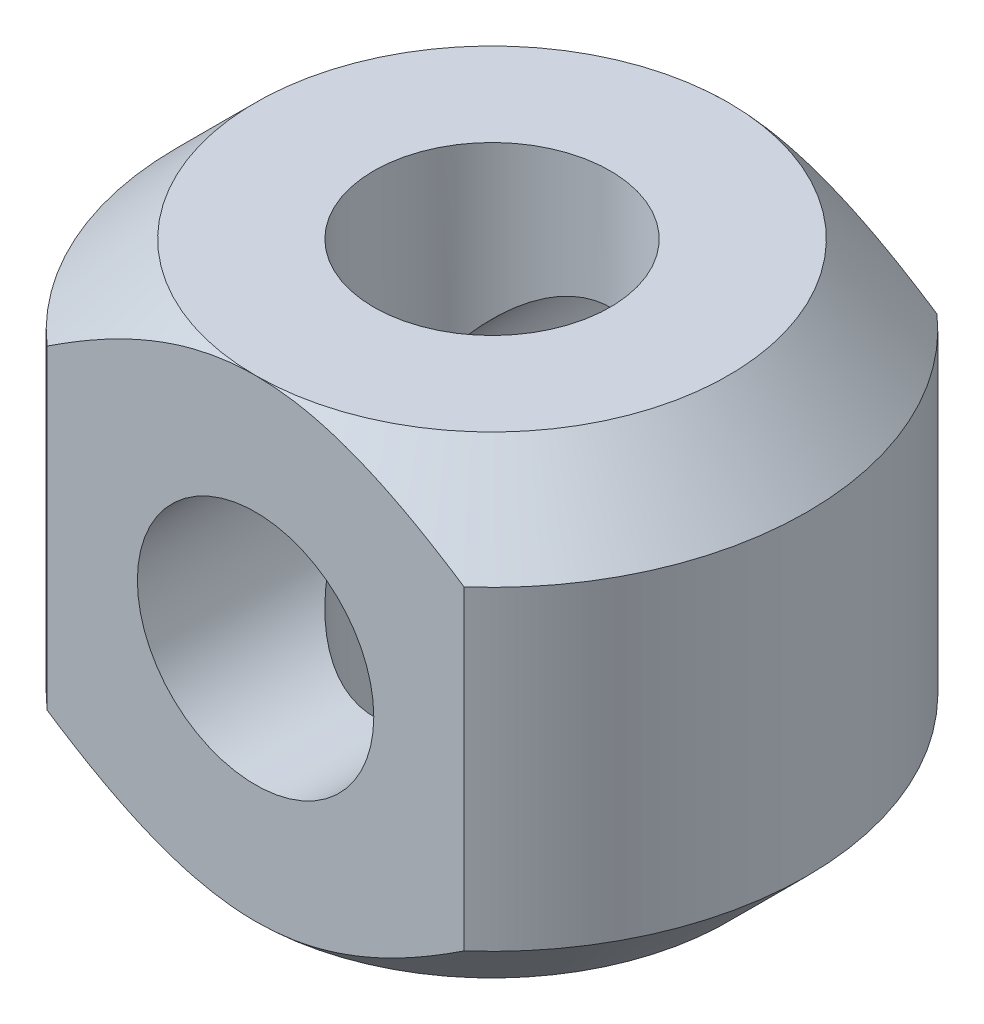
ISO-10303-21;
HEADER;
FILE_DESCRIPTION(('STEP AP214'),'2;1');
FILE_NAME('part.step','',(''),(''),'','','');
FILE_SCHEMA(('AUTOMOTIVE_DESIGN { 1 0 10303 214 1 1 1 1 }'));
ENDSEC;
DATA;
#1=APPLICATION_CONTEXT('core data for automotive mechanical design processes');
#2=APPLICATION_PROTOCOL_DEFINITION('international standard','automotive_design',2000,#1);
#3=PRODUCT_CONTEXT('',#1,'mechanical');
#4=PRODUCT('Part','Part','',(#3));
#5=PRODUCT_RELATED_PRODUCT_CATEGORY('part','',(#4));
#6=PRODUCT_DEFINITION_FORMATION('','',#4);
#7=PRODUCT_DEFINITION_CONTEXT('part definition',#1,'design');
#8=PRODUCT_DEFINITION('design','',#6,#7);
#9=PRODUCT_DEFINITION_SHAPE('','',#8);
#10=(LENGTH_UNIT() NAMED_UNIT(*) SI_UNIT(.MILLI.,.METRE.));
#11=(NAMED_UNIT(*) PLANE_ANGLE_UNIT() SI_UNIT($,.RADIAN.));
#12=(NAMED_UNIT(*) SI_UNIT($,.STERADIAN.) SOLID_ANGLE_UNIT());
#13=UNCERTAINTY_MEASURE_WITH_UNIT(LENGTH_MEASURE(1.E-05),#10,'distance_accuracy_value','');
#14=(GEOMETRIC_REPRESENTATION_CONTEXT(3) GLOBAL_UNCERTAINTY_ASSIGNED_CONTEXT((#13)) GLOBAL_UNIT_ASSIGNED_CONTEXT((#10,
#11,#12)) REPRESENTATION_CONTEXT('',''));
#15=CARTESIAN_POINT('',(0.,0.,0.));
#16=DIRECTION('',(0.,0.,1.));
#17=DIRECTION('',(1.,0.,0.));
#18=AXIS2_PLACEMENT_3D('',#15,#16,#17);
#19=CARTESIAN_POINT('',(0.,6.,0.));
#20=DIRECTION('',(0.,-1.,0.));
#21=DIRECTION('',(0.,0.,-1.));
#22=AXIS2_PLACEMENT_3D('',#19,#20,#21);
#23=CYLINDRICAL_SURFACE('',#22,1.5);
#24=CARTESIAN_POINT('',(0.,3.,0.));
#25=DIRECTION('',(0.,-0.707106781186547,0.707106781186547));
#26=DIRECTION('',(0.,-0.707106781186547,-0.707106781186547));
#27=AXIS2_PLACEMENT_3D('',#24,#25,#26);
#28=ELLIPSE('',#27,2.12132034355964,1.5);
#29=CARTESIAN_POINT('',(-1.5,3.,0.));
#30=VERTEX_POINT('',#29);
#31=CARTESIAN_POINT('',(1.5,3.,0.));
#32=VERTEX_POINT('',#31);
#33=EDGE_CURVE('E107',#30,#32,#28,.F.);
#34=ORIENTED_EDGE('',*,*,#33,.F.);
#35=CARTESIAN_POINT('',(0.,3.,0.));
#36=DIRECTION('',(0.,-0.707106781186547,-0.707106781186547));
#37=DIRECTION('',(0.,-0.707106781186547,0.707106781186547));
#38=AXIS2_PLACEMENT_3D('',#35,#36,#37);
#39=ELLIPSE('',#38,2.12132034355964,1.5);
#40=EDGE_CURVE('E58',#32,#30,#39,.F.);
#41=ORIENTED_EDGE('',*,*,#40,.F.);
#42=EDGE_LOOP('',(#34,#41));
#43=FACE_BOUND('',#42,.T.);
#44=CARTESIAN_POINT('',(0.,6.,0.));
#45=DIRECTION('',(0.,1.,0.));
#46=DIRECTION('',(0.,0.,1.));
#47=AXIS2_PLACEMENT_3D('',#44,#45,#46);
#48=CIRCLE('',#47,1.5);
#49=CARTESIAN_POINT('',(0.,6.,1.5));
#50=VERTEX_POINT('',#49);
#51=EDGE_CURVE('E178',#50,#50,#48,.T.);
#52=ORIENTED_EDGE('',*,*,#51,.T.);
#53=EDGE_LOOP('',(#52));
#54=FACE_BOUND('',#53,.T.);
#55=ADVANCED_FACE('F38',(#43,#54),#23,.F.);
#56=CARTESIAN_POINT('',(0.,6.,0.));
#57=DIRECTION('',(0.,-1.,0.));
#58=DIRECTION('',(0.,0.,-1.));
#59=AXIS2_PLACEMENT_3D('',#56,#57,#58);
#60=CYLINDRICAL_SURFACE('',#59,4.);
#61=DIRECTION('',(0.,-1.,0.));
#62=VECTOR('',#61,1.);
#63=CARTESIAN_POINT('',(2.64575131106459,6.,-3.));
#64=LINE('',#63,#62);
#65=CARTESIAN_POINT('',(2.64575131106459,5.,-3.));
#66=VERTEX_POINT('',#65);
#67=CARTESIAN_POINT('',(2.64575131106459,1.,-3.));
#68=VERTEX_POINT('',#67);
#69=EDGE_CURVE('E66',#66,#68,#64,.T.);
#70=ORIENTED_EDGE('',*,*,#69,.F.);
#71=CARTESIAN_POINT('',(0.,5.,0.));
#72=DIRECTION('',(0.,1.,0.));
#73=DIRECTION('',(0.,0.,1.));
#74=AXIS2_PLACEMENT_3D('',#71,#72,#73);
#75=CIRCLE('',#74,4.);
#76=CARTESIAN_POINT('',(2.64575131106459,5.,3.));
#77=VERTEX_POINT('',#76);
#78=EDGE_CURVE('E191',#66,#77,#75,.F.);
#79=ORIENTED_EDGE('',*,*,#78,.T.);
#80=DIRECTION('',(0.,-1.,0.));
#81=VECTOR('',#80,1.);
#82=CARTESIAN_POINT('',(2.64575131106459,6.,3.));
#83=LINE('',#82,#81);
#84=CARTESIAN_POINT('',(2.64575131106459,1.,3.));
#85=VERTEX_POINT('',#84);
#86=EDGE_CURVE('E156',#85,#77,#83,.F.);
#87=ORIENTED_EDGE('',*,*,#86,.F.);
#88=CARTESIAN_POINT('',(0.,1.,0.));
#89=DIRECTION('',(0.,1.,0.));
#90=DIRECTION('',(0.,0.,1.));
#91=AXIS2_PLACEMENT_3D('',#88,#89,#90);
#92=CIRCLE('',#91,4.);
#93=EDGE_CURVE('E197',#85,#68,#92,.T.);
#94=ORIENTED_EDGE('',*,*,#93,.T.);
#95=EDGE_LOOP('',(#70,#79,#87,#94));
#96=FACE_BOUND('',#95,.T.);
#97=ADVANCED_FACE('F165',(#96),#60,.T.);
#98=DIRECTION('',(0.,-1.,0.));
#99=VECTOR('',#98,1.);
#100=CARTESIAN_POINT('',(-2.64575131106459,6.,-3.));
#101=LINE('',#100,#99);
#102=CARTESIAN_POINT('',(-2.64575131106511,1.0000000000001,-3.));
#103=VERTEX_POINT('',#102);
#104=CARTESIAN_POINT('',(-2.64575131106459,5.,-3.));
#105=VERTEX_POINT('',#104);
#106=EDGE_CURVE('E136',#103,#105,#101,.F.);
#107=ORIENTED_EDGE('',*,*,#106,.F.);
#108=CARTESIAN_POINT('',(-2.64575131106459,1.,3.));
#109=VERTEX_POINT('',#108);
#110=EDGE_CURVE('E196',#103,#109,#92,.T.);
#111=ORIENTED_EDGE('',*,*,#110,.T.);
#112=DIRECTION('',(0.,-1.,0.));
#113=VECTOR('',#112,1.);
#114=CARTESIAN_POINT('',(-2.64575131106459,6.,3.));
#115=LINE('',#114,#113);
#116=CARTESIAN_POINT('',(-2.64575131106459,5.,3.));
#117=VERTEX_POINT('',#116);
#118=EDGE_CURVE('E177',#117,#109,#115,.T.);
#119=ORIENTED_EDGE('',*,*,#118,.F.);
#120=EDGE_CURVE('E192',#117,#105,#75,.F.);
#121=ORIENTED_EDGE('',*,*,#120,.T.);
#122=EDGE_LOOP('',(#107,#111,#119,#121));
#123=FACE_BOUND('',#122,.T.);
#124=ADVANCED_FACE('F163',(#123),#60,.T.);
#125=CARTESIAN_POINT('',(0.,6.,0.));
#126=DIRECTION('',(0.,-1.,0.));
#127=DIRECTION('',(0.,0.,-1.));
#128=AXIS2_PLACEMENT_3D('',#125,#126,#127);
#129=CONICAL_SURFACE('',#128,3.,0.785398163397447);
#130=ORIENTED_EDGE('',*,*,#78,.F.);
#131=CARTESIAN_POINT('',(-5.82766894360965,2.44548054268564,-3.));
#132=CARTESIAN_POINT('',(-5.69264565157082,2.56551170394383,-3.));
#133=CARTESIAN_POINT('',(-5.55720424751877,2.68507706226615,-3.));
#134=CARTESIAN_POINT('',(-5.28526281263324,2.92302671771591,-3.));
#135=CARTESIAN_POINT('',(-5.14876266940286,3.04141088631033,-3.));
#136=CARTESIAN_POINT('',(-4.87390823263204,3.27723936199559,-3.));
#137=CARTESIAN_POINT('',(-4.73554842944571,3.39467725986055,-3.));
#138=CARTESIAN_POINT('',(-4.45728579803168,3.62769999508736,-3.));
#139=CARTESIAN_POINT('',(-4.31738304566827,3.74328492287712,-3.));
#140=CARTESIAN_POINT('',(-4.0273935464928,3.978812959821,-3.));
#141=CARTESIAN_POINT('',(-3.87719092138413,4.09861383010703,-3.));
#142=CARTESIAN_POINT('',(-3.57406261021567,4.33471594515417,-3.));
#143=CARTESIAN_POINT('',(-3.42113710113501,4.4510174160534,-3.));
#144=CARTESIAN_POINT('',(-3.11204258371933,4.67867048121914,-3.));
#145=CARTESIAN_POINT('',(-2.9558797527441,4.79003042112842,-3.));
#146=CARTESIAN_POINT('',(-2.63905224451842,5.00611292138639,-3.));
#147=CARTESIAN_POINT('',(-2.47838923298491,5.11083789201157,-3.));
#148=CARTESIAN_POINT('',(-2.20105121720574,5.28024812540259,-3.));
#149=CARTESIAN_POINT('',(-2.08589532077438,5.34740797142385,-3.));
#150=CARTESIAN_POINT('',(-1.85216902016116,5.47566018301436,-3.));
#151=CARTESIAN_POINT('',(-1.73359756963062,5.53675066318823,-3.));
#152=CARTESIAN_POINT('',(-1.49359958600336,5.65040846914639,-3.));
#153=CARTESIAN_POINT('',(-1.37220500859755,5.70304246880012,-3.));
#154=CARTESIAN_POINT('',(-1.12539482873999,5.79788029664406,-3.));
#155=CARTESIAN_POINT('',(-0.999981821896823,5.84009071015942,-3.));
#156=CARTESIAN_POINT('',(-0.785495010123458,5.90000142111448,-3.));
#157=CARTESIAN_POINT('',(-0.697409804346183,5.92123449787273,-3.));
#158=CARTESIAN_POINT('',(-0.519807167805188,5.95654228224989,-3.));
#159=CARTESIAN_POINT('',(-0.430289987111711,5.97061822596411,-3.));
#160=CARTESIAN_POINT('',(-0.250605005367712,5.99087054147829,-3.));
#161=CARTESIAN_POINT('',(-0.160439693507909,5.99706868788017,-3.));
#162=CARTESIAN_POINT('',(0.0200867484580563,6.00128995752322,-3.));
#163=CARTESIAN_POINT('',(0.110447880856385,5.99931298454876,-3.));
#164=CARTESIAN_POINT('',(0.290452475938834,5.98730850745532,-3.));
#165=CARTESIAN_POINT('',(0.380096975143111,5.97729628822307,-3.));
#166=CARTESIAN_POINT('',(0.558232140308278,5.94977513282106,-3.));
#167=CARTESIAN_POINT('',(0.646722522987482,5.93226439051633,-3.));
#168=CARTESIAN_POINT('',(0.822421138374649,5.89048841082867,-3.));
#169=CARTESIAN_POINT('',(0.909623389360468,5.86619833152707,-3.));
#170=CARTESIAN_POINT('',(1.08218205018659,5.81183291607167,-3.));
#171=CARTESIAN_POINT('',(1.16753847240275,5.78175761871984,-3.));
#172=CARTESIAN_POINT('',(1.36255972060936,5.70665207620656,-3.));
#173=CARTESIAN_POINT('',(1.47154946468152,5.65987705856508,-3.));
#174=CARTESIAN_POINT('',(1.6864943319652,5.55976597336534,-3.));
#175=CARTESIAN_POINT('',(1.79244788664407,5.50642658731052,-3.));
#176=CARTESIAN_POINT('',(2.00181172191152,5.39453080451191,-3.));
#177=CARTESIAN_POINT('',(2.10521655865766,5.33596429939934,-3.));
#178=CARTESIAN_POINT('',(2.30961365299042,5.21482595752772,-3.));
#179=CARTESIAN_POINT('',(2.41060630215492,5.15225477701219,-3.));
#180=CARTESIAN_POINT('',(2.6119777433554,5.02301843284652,-3.));
#181=CARTESIAN_POINT('',(2.71232698806022,4.95630744345417,-3.));
#182=CARTESIAN_POINT('',(2.91124115726192,4.82027971978695,-3.));
#183=CARTESIAN_POINT('',(3.00980602584026,4.75096290405974,-3.));
#184=CARTESIAN_POINT('',(3.20530008376453,4.61031358241865,-3.));
#185=CARTESIAN_POINT('',(3.30223112276437,4.53898364011652,-3.));
#186=CARTESIAN_POINT('',(3.49480227644251,4.39461337833456,-3.));
#187=CARTESIAN_POINT('',(3.59044243878053,4.32157312227407,-3.));
#188=CARTESIAN_POINT('',(3.79894899514681,4.15986763368453,-3.));
#189=CARTESIAN_POINT('',(3.91158345219022,4.0709036918908,-3.));
#190=CARTESIAN_POINT('',(4.13555016737915,3.89134957432037,-3.));
#191=CARTESIAN_POINT('',(4.24688239022591,3.80075935462921,-3.));
#192=CARTESIAN_POINT('',(4.57927058312801,3.52698944146153,-3.));
#193=CARTESIAN_POINT('',(4.79869462587898,3.34182888957678,-3.));
#194=CARTESIAN_POINT('',(5.23449193466422,2.96779760857479,-3.));
#195=CARTESIAN_POINT('',(5.4508639407615,2.77892542002454,-3.));
#196=CARTESIAN_POINT('',(5.88127733851625,2.39853871647232,-3.));
#197=CARTESIAN_POINT('',(6.09531867916927,2.20702414385135,-3.));
#198=CARTESIAN_POINT('',(6.52204578608306,1.82165215175749,-3.));
#199=CARTESIAN_POINT('',(6.73472804400037,1.62779085493634,-3.));
#200=CARTESIAN_POINT('',(7.15870603721308,1.23855424713438,-3.));
#201=CARTESIAN_POINT('',(7.3700017544279,1.04317891648264,-3.));
#202=CARTESIAN_POINT('',(8.00215026496702,0.455401055154621,-3.));
#203=CARTESIAN_POINT('',(8.42137383524249,0.0612471563067597,-3.));
#204=CARTESIAN_POINT('',(9.20767583522319,-0.683360113665567,-3.));
#205=CARTESIAN_POINT('',(9.57506968487876,-1.03348148688747,-3.));
#206=CARTESIAN_POINT('',(10.3082794985865,-1.73542736123001,-3.));
#207=CARTESIAN_POINT('',(10.6740953415019,-2.08725198885216,-3.));
#208=CARTESIAN_POINT('',(11.4033091898676,-2.7909426704156,-3.));
#209=CARTESIAN_POINT('',(11.7667111889149,-3.14280459006603,-3.));
#210=CARTESIAN_POINT('',(12.4925661629926,-3.84744425995365,-3.));
#211=CARTESIAN_POINT('',(12.8550192164009,-4.20022192943283,-3.));
#212=CARTESIAN_POINT('',(13.217143876347,-4.55333509687039,-3.));
#213=B_SPLINE_CURVE_WITH_KNOTS('',3,(#131,#132,#133,#134,#135,#136,#137,#138,#139,#140,#141,
#142,#143,#144,#145,#146,#147,#148,#149,#150,#151,#152,#153,#154,#155,#156,#157,#158,#159,#160,
#161,#162,#163,#164,#165,#166,#167,#168,#169,#170,#171,#172,#173,#174,#175,#176,#177,#178,#179,
#180,#181,#182,#183,#184,#185,#186,#187,#188,#189,#190,#191,#192,#193,#194,#195,#196,#197,#198,
#199,#200,#201,#202,#203,#204,#205,#206,#207,#208,#209,#210,#211,#212),.UNSPECIFIED.,.F.,.F.,(4,
2,2,2,2,2,2,2,2,2,2,2,2,2,2,2,2,2,2,2,2,2,2,2,2,2,2,2,2,2,2,2,2,2,2,2,2,2,2,2,4),(0.,
0.541989497215124,1.084037342392,1.62846524927106,2.17286650581254,2.74921195485768,
3.32552007897706,3.90081464769181,4.47589901724459,4.87569159278187,5.27560797459739,
5.67219758195497,6.06853599056224,6.34010826464292,6.6116336200295,6.88240682272135,
7.15318321223963,7.42344574019037,7.69377340168831,7.96510494845384,8.23643467543901,
8.59195180149539,8.94764939675419,9.30405040632831,9.66039316150123,10.0218435300451,
10.3833052061349,10.7443256841451,11.1053327964597,11.5359059415829,11.9664907310309,
12.8277497007735,13.6893543801821,14.5509778772604,15.4143015886372,16.2776365355264,
18.0038627797245,19.5263781829777,21.0490084541613,22.5665080627558,24.0838781081648),.UNSPECIFIED.);
#214=CARTESIAN_POINT('',(0.,6.,-3.));
#215=VERTEX_POINT('',#214);
#216=EDGE_CURVE('E155',#66,#215,#213,.F.);
#217=ORIENTED_EDGE('',*,*,#216,.T.);
#218=CARTESIAN_POINT('',(0.,6.,0.));
#219=DIRECTION('',(0.,1.,0.));
#220=DIRECTION('',(0.,0.,1.));
#221=AXIS2_PLACEMENT_3D('',#218,#219,#220);
#222=CIRCLE('',#221,3.);
#223=CARTESIAN_POINT('',(0.,6.,3.));
#224=VERTEX_POINT('',#223);
#225=EDGE_CURVE('E187',#224,#215,#222,.T.);
#226=ORIENTED_EDGE('',*,*,#225,.F.);
#227=CARTESIAN_POINT('',(-5.82766894360965,2.44548054268564,3.));
#228=CARTESIAN_POINT('',(-5.69264565157082,2.56551170394383,3.));
#229=CARTESIAN_POINT('',(-5.55720424751877,2.68507706226614,3.));
#230=CARTESIAN_POINT('',(-5.28526281263324,2.92302671771591,3.));
#231=CARTESIAN_POINT('',(-5.14876266940286,3.04141088631033,3.));
#232=CARTESIAN_POINT('',(-4.87390823263204,3.27723936199559,3.));
#233=CARTESIAN_POINT('',(-4.73554842944571,3.39467725986055,3.));
#234=CARTESIAN_POINT('',(-4.45728579803168,3.62769999508736,3.));
#235=CARTESIAN_POINT('',(-4.31738304566827,3.74328492287712,3.));
#236=CARTESIAN_POINT('',(-4.0273935464928,3.978812959821,3.));
#237=CARTESIAN_POINT('',(-3.87719092138413,4.09861383010703,3.));
#238=CARTESIAN_POINT('',(-3.57406261021567,4.33471594515417,3.));
#239=CARTESIAN_POINT('',(-3.42113710113501,4.4510174160534,3.));
#240=CARTESIAN_POINT('',(-3.11204258371933,4.67867048121914,3.));
#241=CARTESIAN_POINT('',(-2.9558797527441,4.79003042112842,3.));
#242=CARTESIAN_POINT('',(-2.63905224451842,5.00611292138639,3.));
#243=CARTESIAN_POINT('',(-2.47838923298491,5.11083789201157,3.));
#244=CARTESIAN_POINT('',(-2.20105121720574,5.28024812540259,3.));
#245=CARTESIAN_POINT('',(-2.08589532077438,5.34740797142385,3.));
#246=CARTESIAN_POINT('',(-1.85216902016116,5.47566018301436,3.));
#247=CARTESIAN_POINT('',(-1.73359756963062,5.53675066318823,3.));
#248=CARTESIAN_POINT('',(-1.49359958600336,5.65040846914639,3.));
#249=CARTESIAN_POINT('',(-1.37220500859755,5.70304246880012,3.));
#250=CARTESIAN_POINT('',(-1.12539482873999,5.79788029664406,3.));
#251=CARTESIAN_POINT('',(-0.999981821896822,5.84009071015942,3.));
#252=CARTESIAN_POINT('',(-0.785495010123457,5.90000142111448,3.));
#253=CARTESIAN_POINT('',(-0.697409804346181,5.92123449787273,3.));
#254=CARTESIAN_POINT('',(-0.519807167805186,5.95654228224989,3.));
#255=CARTESIAN_POINT('',(-0.430289987111709,5.97061822596411,3.));
#256=CARTESIAN_POINT('',(-0.25060500536771,5.99087054147829,3.));
#257=CARTESIAN_POINT('',(-0.160439693507908,5.99706868788017,3.));
#258=CARTESIAN_POINT('',(0.0200867484580576,6.00128995752322,3.));
#259=CARTESIAN_POINT('',(0.110447880856386,5.99931298454876,3.));
#260=CARTESIAN_POINT('',(0.290452475938835,5.98730850745532,3.));
#261=CARTESIAN_POINT('',(0.380096975143113,5.97729628822307,3.));
#262=CARTESIAN_POINT('',(0.558232140308279,5.94977513282106,3.));
#263=CARTESIAN_POINT('',(0.646722522987484,5.93226439051633,3.));
#264=CARTESIAN_POINT('',(0.82242113837465,5.89048841082867,3.));
#265=CARTESIAN_POINT('',(0.909623389360469,5.86619833152706,3.));
#266=CARTESIAN_POINT('',(1.08218205018659,5.81183291607167,3.));
#267=CARTESIAN_POINT('',(1.16753847240276,5.78175761871984,3.));
#268=CARTESIAN_POINT('',(1.36255972060936,5.70665207620656,3.));
#269=CARTESIAN_POINT('',(1.47154946468153,5.65987705856507,3.));
#270=CARTESIAN_POINT('',(1.68649433196521,5.55976597336534,3.));
#271=CARTESIAN_POINT('',(1.79244788664407,5.50642658731052,3.));
#272=CARTESIAN_POINT('',(2.00181172191152,5.39453080451191,3.));
#273=CARTESIAN_POINT('',(2.10521655865767,5.33596429939934,3.));
#274=CARTESIAN_POINT('',(2.30961365299042,5.21482595752772,3.));
#275=CARTESIAN_POINT('',(2.41060630215492,5.15225477701219,3.));
#276=CARTESIAN_POINT('',(2.61197774335541,5.02301843284652,3.));
#277=CARTESIAN_POINT('',(2.71232698806022,4.95630744345416,3.));
#278=CARTESIAN_POINT('',(2.91124115726192,4.82027971978695,3.));
#279=CARTESIAN_POINT('',(3.00980602584027,4.75096290405974,3.));
#280=CARTESIAN_POINT('',(3.20530008376454,4.61031358241864,3.));
#281=CARTESIAN_POINT('',(3.30223112276438,4.53898364011651,3.));
#282=CARTESIAN_POINT('',(3.49480227644252,4.39461337833456,3.));
#283=CARTESIAN_POINT('',(3.59044243878054,4.32157312227406,3.));
#284=CARTESIAN_POINT('',(3.79894899514682,4.15986763368452,3.));
#285=CARTESIAN_POINT('',(3.91158345219023,4.0709036918908,3.));
#286=CARTESIAN_POINT('',(4.13555016737916,3.89134957432036,3.));
#287=CARTESIAN_POINT('',(4.24688239022593,3.8007593546292,3.));
#288=CARTESIAN_POINT('',(4.57927058312802,3.52698944146152,3.));
#289=CARTESIAN_POINT('',(4.79869462587899,3.34182888957677,3.));
#290=CARTESIAN_POINT('',(5.23449193466423,2.96779760857478,3.));
#291=CARTESIAN_POINT('',(5.45086394076152,2.77892542002452,3.));
#292=CARTESIAN_POINT('',(5.88127733851627,2.3985387164723,3.));
#293=CARTESIAN_POINT('',(6.09531867916929,2.20702414385133,3.));
#294=CARTESIAN_POINT('',(6.52204578608308,1.82165215175747,3.));
#295=CARTESIAN_POINT('',(6.73472804400039,1.62779085493632,3.));
#296=CARTESIAN_POINT('',(7.1587060372131,1.23855424713436,3.));
#297=CARTESIAN_POINT('',(7.37000175442792,1.04317891648261,3.));
#298=CARTESIAN_POINT('',(8.00215026496705,0.455401055154595,3.));
#299=CARTESIAN_POINT('',(8.42137383524252,0.0612471563067314,3.));
#300=CARTESIAN_POINT('',(9.20767583522323,-0.683360113665599,3.));
#301=CARTESIAN_POINT('',(9.5750696848788,-1.03348148688751,3.));
#302=CARTESIAN_POINT('',(10.3082794985865,-1.73542736123005,3.));
#303=CARTESIAN_POINT('',(10.674095341502,-2.0872519888522,3.));
#304=CARTESIAN_POINT('',(11.4033091898676,-2.79094267041564,3.));
#305=CARTESIAN_POINT('',(11.7667111889149,-3.14280459006608,3.));
#306=CARTESIAN_POINT('',(12.4925661629926,-3.84744425995369,3.));
#307=CARTESIAN_POINT('',(12.855019216401,-4.20022192943288,3.));
#308=CARTESIAN_POINT('',(13.2171438763471,-4.55333509687044,3.));
#309=B_SPLINE_CURVE_WITH_KNOTS('',3,(#227,#228,#229,#230,#231,#232,#233,#234,#235,#236,#237,
#238,#239,#240,#241,#242,#243,#244,#245,#246,#247,#248,#249,#250,#251,#252,#253,#254,#255,#256,
#257,#258,#259,#260,#261,#262,#263,#264,#265,#266,#267,#268,#269,#270,#271,#272,#273,#274,#275,
#276,#277,#278,#279,#280,#281,#282,#283,#284,#285,#286,#287,#288,#289,#290,#291,#292,#293,#294,
#295,#296,#297,#298,#299,#300,#301,#302,#303,#304,#305,#306,#307,#308),.UNSPECIFIED.,.F.,.F.,(4,
2,2,2,2,2,2,2,2,2,2,2,2,2,2,2,2,2,2,2,2,2,2,2,2,2,2,2,2,2,2,2,2,2,2,2,2,2,2,2,4),(0.,
0.541989497215123,1.084037342392,1.62846524927106,2.17286650581254,2.74921195485768,
3.32552007897707,3.90081464769181,4.47589901724459,4.87569159278187,5.27560797459739,
5.67219758195497,6.06853599056224,6.34010826464292,6.6116336200295,6.88240682272135,
7.15318321223963,7.42344574019037,7.69377340168831,7.96510494845384,8.23643467543901,
8.59195180149539,8.94764939675419,9.30405040632831,9.66039316150124,10.0218435300451,
10.383305206135,10.7443256841451,11.1053327964597,11.5359059415829,11.9664907310309,
12.8277497007736,13.6893543801821,14.5509778772604,15.4143015886372,16.2776365355264,
18.0038627797245,19.5263781829778,21.0490084541614,22.5665080627558,24.0838781081648),.UNSPECIFIED.);
#310=EDGE_CURVE('E169',#224,#77,#309,.T.);
#311=ORIENTED_EDGE('',*,*,#310,.T.);
#312=EDGE_LOOP('',(#130,#217,#226,#311));
#313=FACE_BOUND('',#312,.T.);
#314=ADVANCED_FACE('F158',(#313),#129,.T.);
#315=EDGE_CURVE('E182',#215,#224,#222,.T.);
#316=ORIENTED_EDGE('',*,*,#315,.F.);
#317=EDGE_CURVE('E148',#215,#105,#213,.F.);
#318=ORIENTED_EDGE('',*,*,#317,.T.);
#319=ORIENTED_EDGE('',*,*,#120,.F.);
#320=EDGE_CURVE('E176',#117,#224,#309,.T.);
#321=ORIENTED_EDGE('',*,*,#320,.T.);
#322=EDGE_LOOP('',(#316,#318,#319,#321));
#323=FACE_BOUND('',#322,.T.);
#324=ADVANCED_FACE('F162',(#323),#129,.T.);
#325=CARTESIAN_POINT('',(0.,1.,0.));
#326=DIRECTION('',(0.,1.,0.));
#327=DIRECTION('',(0.,0.,1.));
#328=AXIS2_PLACEMENT_3D('',#325,#326,#327);
#329=CONICAL_SURFACE('',#328,4.,0.78539816339745);
#330=ORIENTED_EDGE('',*,*,#110,.F.);
#331=CARTESIAN_POINT('',(-5.82766894360965,3.55451945731434,-3.));
#332=CARTESIAN_POINT('',(-5.69264565157082,3.43448829605616,-3.));
#333=CARTESIAN_POINT('',(-5.55720424751877,3.31492293773384,-3.));
#334=CARTESIAN_POINT('',(-5.28526281263325,3.07697328228408,-3.));
#335=CARTESIAN_POINT('',(-5.14876266940287,2.95858911368967,-3.));
#336=CARTESIAN_POINT('',(-4.87390823263204,2.72276063800441,-3.));
#337=CARTESIAN_POINT('',(-4.73554842944572,2.60532274013944,-3.));
#338=CARTESIAN_POINT('',(-4.45728579803169,2.37230000491263,-3.));
#339=CARTESIAN_POINT('',(-4.31738304566827,2.25671507712287,-3.));
#340=CARTESIAN_POINT('',(-4.0273935464928,2.021187040179,-3.));
#341=CARTESIAN_POINT('',(-3.87719092138413,1.90138616989296,-3.));
#342=CARTESIAN_POINT('',(-3.57406261021567,1.66528405484582,-3.));
#343=CARTESIAN_POINT('',(-3.42113710113501,1.54898258394659,-3.));
#344=CARTESIAN_POINT('',(-3.11204258371933,1.32132951878086,-3.));
#345=CARTESIAN_POINT('',(-2.9558797527441,1.20996957887158,-3.));
#346=CARTESIAN_POINT('',(-2.63905224451842,0.993887078613611,-3.));
#347=CARTESIAN_POINT('',(-2.47838923298491,0.889162107988428,-3.));
#348=CARTESIAN_POINT('',(-2.20105121720574,0.71975187459741,-3.));
#349=CARTESIAN_POINT('',(-2.08589532077438,0.652592028576152,-3.));
#350=CARTESIAN_POINT('',(-1.85216902016116,0.524339816985644,-3.));
#351=CARTESIAN_POINT('',(-1.73359756963061,0.463249336811768,-3.));
#352=CARTESIAN_POINT('',(-1.49359958600336,0.34959153085361,-3.));
#353=CARTESIAN_POINT('',(-1.37220500859754,0.29695753119988,-3.));
#354=CARTESIAN_POINT('',(-1.12539482873998,0.202119703355939,-3.));
#355=CARTESIAN_POINT('',(-0.999981821896816,0.159909289840578,-3.));
#356=CARTESIAN_POINT('',(-0.785495010123449,0.0999985788855249,-3.));
#357=CARTESIAN_POINT('',(-0.697409804346173,0.0787655021272688,-3.));
#358=CARTESIAN_POINT('',(-0.519807167805177,0.0434577177501132,-3.));
#359=CARTESIAN_POINT('',(-0.430289987111699,0.0293817740358948,-3.));
#360=CARTESIAN_POINT('',(-0.250605005367699,0.00912945852171239,-3.));
#361=CARTESIAN_POINT('',(-0.160439693507896,0.00293131211983011,-3.));
#362=CARTESIAN_POINT('',(0.0200867484580702,-0.00128995752321658,-3.));
#363=CARTESIAN_POINT('',(0.110447880856399,0.000687015451241492,-3.));
#364=CARTESIAN_POINT('',(0.290452475938849,0.0126914925446832,-3.));
#365=CARTESIAN_POINT('',(0.380096975143127,0.0227037117769356,-3.));
#366=CARTESIAN_POINT('',(0.558232140308295,0.0502248671789516,-3.));
#367=CARTESIAN_POINT('',(0.6467225229875,0.0677356094836828,-3.));
#368=CARTESIAN_POINT('',(0.822421138374667,0.109511589171336,-3.));
#369=CARTESIAN_POINT('',(0.909623389360487,0.133801668472945,-3.));
#370=CARTESIAN_POINT('',(1.08218205018661,0.188167083928339,-3.));
#371=CARTESIAN_POINT('',(1.16753847240277,0.218242381280174,-3.));
#372=CARTESIAN_POINT('',(1.36255972060938,0.293347923793457,-3.));
#373=CARTESIAN_POINT('',(1.47154946468155,0.340122941434939,-3.));
#374=CARTESIAN_POINT('',(1.68649433196523,0.44023402663468,-3.));
#375=CARTESIAN_POINT('',(1.7924478866441,0.493573412689496,-3.));
#376=CARTESIAN_POINT('',(2.00181172191156,0.60546919548811,-3.));
#377=CARTESIAN_POINT('',(2.1052165586577,0.664035700600683,-3.));
#378=CARTESIAN_POINT('',(2.30961365299046,0.785174042472309,-3.));
#379=CARTESIAN_POINT('',(2.41060630215497,0.847745222987839,-3.));
#380=CARTESIAN_POINT('',(2.61197774335545,0.976981567153511,-3.));
#381=CARTESIAN_POINT('',(2.71232698806027,1.04369255654587,-3.));
#382=CARTESIAN_POINT('',(2.91124115726198,1.17972028021309,-3.));
#383=CARTESIAN_POINT('',(3.00980602584032,1.2490370959403,-3.));
#384=CARTESIAN_POINT('',(3.2053000837646,1.38968641758139,-3.));
#385=CARTESIAN_POINT('',(3.30223112276444,1.46101635988353,-3.));
#386=CARTESIAN_POINT('',(3.49480227644258,1.60538662166549,-3.));
#387=CARTESIAN_POINT('',(3.59044243878061,1.67842687772598,-3.));
#388=CARTESIAN_POINT('',(3.79894899514689,1.84013236631553,-3.));
#389=CARTESIAN_POINT('',(3.9115834521903,1.92909630810926,-3.));
#390=CARTESIAN_POINT('',(4.13555016737924,2.1086504256797,-3.));
#391=CARTESIAN_POINT('',(4.24688239022601,2.19924064537086,-3.));
#392=CARTESIAN_POINT('',(4.57927058312811,2.47301055853854,-3.));
#393=CARTESIAN_POINT('',(4.79869462587908,2.6581711104233,-3.));
#394=CARTESIAN_POINT('',(5.23449193466434,3.0322023914253,-3.));
#395=CARTESIAN_POINT('',(5.45086394076163,3.22107457997556,-3.));
#396=CARTESIAN_POINT('',(5.88127733851639,3.60146128352779,-3.));
#397=CARTESIAN_POINT('',(6.09531867916942,3.79297585614876,-3.));
#398=CARTESIAN_POINT('',(6.52204578608322,4.17834784824263,-3.));
#399=CARTESIAN_POINT('',(6.73472804400054,4.37220914506378,-3.));
#400=CARTESIAN_POINT('',(7.15870603721326,4.76144575286576,-3.));
#401=CARTESIAN_POINT('',(7.37000175442808,4.95682108351751,-3.));
#402=CARTESIAN_POINT('',(8.00215026496723,5.54459894484554,-3.));
#403=CARTESIAN_POINT('',(8.4213738352427,5.93875284369341,-3.));
#404=CARTESIAN_POINT('',(9.20767583522343,6.68336011366576,-3.));
#405=CARTESIAN_POINT('',(9.57506968487901,7.03348148688767,-3.));
#406=CARTESIAN_POINT('',(10.3082794985867,7.73542736123023,-3.));
#407=CARTESIAN_POINT('',(10.6740953415022,8.08725198885239,-3.));
#408=CARTESIAN_POINT('',(11.4033091898679,8.79094267041585,-3.));
#409=CARTESIAN_POINT('',(11.7667111889152,9.14280459006629,-3.));
#410=CARTESIAN_POINT('',(12.4925661629929,9.84744425995393,-3.));
#411=CARTESIAN_POINT('',(12.8550192164013,10.2002219294331,-3.));
#412=CARTESIAN_POINT('',(13.2171438763474,10.5533350968707,-3.));
#413=B_SPLINE_CURVE_WITH_KNOTS('',3,(#331,#332,#333,#334,#335,#336,#337,#338,#339,#340,#341,
#342,#343,#344,#345,#346,#347,#348,#349,#350,#351,#352,#353,#354,#355,#356,#357,#358,#359,#360,
#361,#362,#363,#364,#365,#366,#367,#368,#369,#370,#371,#372,#373,#374,#375,#376,#377,#378,#379,
#380,#381,#382,#383,#384,#385,#386,#387,#388,#389,#390,#391,#392,#393,#394,#395,#396,#397,#398,
#399,#400,#401,#402,#403,#404,#405,#406,#407,#408,#409,#410,#411,#412),.UNSPECIFIED.,.F.,.F.,(4,
2,2,2,2,2,2,2,2,2,2,2,2,2,2,2,2,2,2,2,2,2,2,2,2,2,2,2,2,2,2,2,2,2,2,2,2,2,2,2,4),(0.,
0.541989497215122,1.084037342392,1.62846524927106,2.17286650581254,2.74921195485767,
3.32552007897706,3.9008146476918,4.47589901724458,4.87569159278186,5.27560797459738,
5.67219758195497,6.06853599056224,6.34010826464293,6.6116336200295,6.88240682272136,
7.15318321223964,7.42344574019038,7.69377340168832,7.96510494845386,8.23643467543902,
8.59195180149541,8.94764939675422,9.30405040632835,9.66039316150128,10.0218435300451,
10.383305206135,10.7443256841452,11.1053327964597,11.535905941583,11.966490731031,
12.8277497007737,13.6893543801822,14.5509778772606,15.4143015886374,16.2776365355266,
18.0038627797248,19.526378182978,21.0490084541617,22.5665080627562,24.0838781081652),.UNSPECIFIED.);
#414=CARTESIAN_POINT('',(0.,0.,-3.));
#415=VERTEX_POINT('',#414);
#416=EDGE_CURVE('E135',#103,#415,#413,.T.);
#417=ORIENTED_EDGE('',*,*,#416,.T.);
#418=CARTESIAN_POINT('',(0.,0.,0.));
#419=DIRECTION('',(0.,1.,0.));
#420=DIRECTION('',(0.,0.,1.));
#421=AXIS2_PLACEMENT_3D('',#418,#419,#420);
#422=CIRCLE('',#421,3.);
#423=CARTESIAN_POINT('',(0.,0.,3.));
#424=VERTEX_POINT('',#423);
#425=EDGE_CURVE('E201',#424,#415,#422,.F.);
#426=ORIENTED_EDGE('',*,*,#425,.F.);
#427=CARTESIAN_POINT('',(-5.82766894360965,3.55451945731435,3.));
#428=CARTESIAN_POINT('',(-5.69264565157082,3.43448829605616,3.));
#429=CARTESIAN_POINT('',(-5.55720424751877,3.31492293773384,3.));
#430=CARTESIAN_POINT('',(-5.28526281263325,3.07697328228407,3.));
#431=CARTESIAN_POINT('',(-5.14876266940286,2.95858911368966,3.));
#432=CARTESIAN_POINT('',(-4.87390823263204,2.7227606380044,3.));
#433=CARTESIAN_POINT('',(-4.73554842944571,2.60532274013944,3.));
#434=CARTESIAN_POINT('',(-4.45728579803168,2.37230000491263,3.));
#435=CARTESIAN_POINT('',(-4.31738304566827,2.25671507712287,3.));
#436=CARTESIAN_POINT('',(-4.0273935464928,2.021187040179,3.));
#437=CARTESIAN_POINT('',(-3.87719092138413,1.90138616989296,3.));
#438=CARTESIAN_POINT('',(-3.57406261021567,1.66528405484582,3.));
#439=CARTESIAN_POINT('',(-3.42113710113501,1.54898258394659,3.));
#440=CARTESIAN_POINT('',(-3.11204258371933,1.32132951878086,3.));
#441=CARTESIAN_POINT('',(-2.9558797527441,1.20996957887158,3.));
#442=CARTESIAN_POINT('',(-2.63905224451842,0.99388707861361,3.));
#443=CARTESIAN_POINT('',(-2.47838923298491,0.889162107988427,3.));
#444=CARTESIAN_POINT('',(-2.20105121720574,0.719751874597409,3.));
#445=CARTESIAN_POINT('',(-2.08589532077438,0.652592028576152,3.));
#446=CARTESIAN_POINT('',(-1.85216902016116,0.524339816985644,3.));
#447=CARTESIAN_POINT('',(-1.73359756963061,0.463249336811768,3.));
#448=CARTESIAN_POINT('',(-1.49359958600336,0.349591530853611,3.));
#449=CARTESIAN_POINT('',(-1.37220500859754,0.29695753119988,3.));
#450=CARTESIAN_POINT('',(-1.12539482873998,0.202119703355939,3.));
#451=CARTESIAN_POINT('',(-0.999981821896815,0.159909289840578,3.));
#452=CARTESIAN_POINT('',(-0.785495010123449,0.0999985788855258,3.));
#453=CARTESIAN_POINT('',(-0.697409804346173,0.0787655021272694,3.));
#454=CARTESIAN_POINT('',(-0.519807167805177,0.0434577177501134,3.));
#455=CARTESIAN_POINT('',(-0.430289987111699,0.0293817740358947,3.));
#456=CARTESIAN_POINT('',(-0.250605005367699,0.00912945852171235,3.));
#457=CARTESIAN_POINT('',(-0.160439693507896,0.0029313121198304,3.));
#458=CARTESIAN_POINT('',(0.0200867484580708,-0.00128995752321573,3.));
#459=CARTESIAN_POINT('',(0.1104478808564,0.000687015451242553,3.));
#460=CARTESIAN_POINT('',(0.29045247593885,0.0126914925446841,3.));
#461=CARTESIAN_POINT('',(0.380096975143128,0.0227037117769361,3.));
#462=CARTESIAN_POINT('',(0.558232140308295,0.0502248671789519,3.));
#463=CARTESIAN_POINT('',(0.6467225229875,0.0677356094836832,3.));
#464=CARTESIAN_POINT('',(0.822421138374667,0.109511589171337,3.));
#465=CARTESIAN_POINT('',(0.909623389360486,0.133801668472945,3.));
#466=CARTESIAN_POINT('',(1.08218205018661,0.188167083928339,3.));
#467=CARTESIAN_POINT('',(1.16753847240277,0.218242381280174,3.));
#468=CARTESIAN_POINT('',(1.36255972060939,0.293347923793457,3.));
#469=CARTESIAN_POINT('',(1.47154946468155,0.34012294143494,3.));
#470=CARTESIAN_POINT('',(1.68649433196524,0.440234026634681,3.));
#471=CARTESIAN_POINT('',(1.7924478866441,0.493573412689497,3.));
#472=CARTESIAN_POINT('',(2.00181172191156,0.605469195488112,3.));
#473=CARTESIAN_POINT('',(2.1052165586577,0.664035700600684,3.));
#474=CARTESIAN_POINT('',(2.30961365299046,0.785174042472311,3.));
#475=CARTESIAN_POINT('',(2.41060630215497,0.847745222987841,3.));
#476=CARTESIAN_POINT('',(2.61197774335546,0.976981567153514,3.));
#477=CARTESIAN_POINT('',(2.71232698806027,1.04369255654587,3.));
#478=CARTESIAN_POINT('',(2.91124115726198,1.17972028021309,3.));
#479=CARTESIAN_POINT('',(3.00980602584032,1.2490370959403,3.));
#480=CARTESIAN_POINT('',(3.2053000837646,1.3896864175814,3.));
#481=CARTESIAN_POINT('',(3.30223112276444,1.46101635988353,3.));
#482=CARTESIAN_POINT('',(3.49480227644259,1.60538662166549,3.));
#483=CARTESIAN_POINT('',(3.59044243878061,1.67842687772598,3.));
#484=CARTESIAN_POINT('',(3.7989489951469,1.84013236631553,3.));
#485=CARTESIAN_POINT('',(3.91158345219031,1.92909630810926,3.));
#486=CARTESIAN_POINT('',(4.13555016737924,2.1086504256797,3.));
#487=CARTESIAN_POINT('',(4.24688239022601,2.19924064537086,3.));
#488=CARTESIAN_POINT('',(4.57927058312812,2.47301055853855,3.));
#489=CARTESIAN_POINT('',(4.79869462587909,2.6581711104233,3.));
#490=CARTESIAN_POINT('',(5.23449193466435,3.03220239142531,3.));
#491=CARTESIAN_POINT('',(5.45086394076164,3.22107457997557,3.));
#492=CARTESIAN_POINT('',(5.8812773385164,3.6014612835278,3.));
#493=CARTESIAN_POINT('',(6.09531867916943,3.79297585614877,3.));
#494=CARTESIAN_POINT('',(6.52204578608323,4.17834784824264,3.));
#495=CARTESIAN_POINT('',(6.73472804400055,4.3722091450638,3.));
#496=CARTESIAN_POINT('',(7.15870603721327,4.76144575286577,3.));
#497=CARTESIAN_POINT('',(7.37000175442809,4.95682108351752,3.));
#498=CARTESIAN_POINT('',(8.00215026496724,5.54459894484555,3.));
#499=CARTESIAN_POINT('',(8.42137383524272,5.93875284369343,3.));
#500=CARTESIAN_POINT('',(9.20767583522344,6.68336011366577,3.));
#501=CARTESIAN_POINT('',(9.57506968487903,7.03348148688769,3.));
#502=CARTESIAN_POINT('',(10.3082794985867,7.73542736123025,3.));
#503=CARTESIAN_POINT('',(10.6740953415022,8.08725198885241,3.));
#504=CARTESIAN_POINT('',(11.4033091898679,8.79094267041587,3.));
#505=CARTESIAN_POINT('',(11.7667111889152,9.14280459006631,3.));
#506=CARTESIAN_POINT('',(12.4925661629929,9.84744425995395,3.));
#507=CARTESIAN_POINT('',(12.8550192164013,10.2002219294331,3.));
#508=CARTESIAN_POINT('',(13.2171438763474,10.5533350968707,3.));
#509=B_SPLINE_CURVE_WITH_KNOTS('',3,(#427,#428,#429,#430,#431,#432,#433,#434,#435,#436,#437,
#438,#439,#440,#441,#442,#443,#444,#445,#446,#447,#448,#449,#450,#451,#452,#453,#454,#455,#456,
#457,#458,#459,#460,#461,#462,#463,#464,#465,#466,#467,#468,#469,#470,#471,#472,#473,#474,#475,
#476,#477,#478,#479,#480,#481,#482,#483,#484,#485,#486,#487,#488,#489,#490,#491,#492,#493,#494,
#495,#496,#497,#498,#499,#500,#501,#502,#503,#504,#505,#506,#507,#508),.UNSPECIFIED.,.F.,.F.,(4,
2,2,2,2,2,2,2,2,2,2,2,2,2,2,2,2,2,2,2,2,2,2,2,2,2,2,2,2,2,2,2,2,2,2,2,2,2,2,2,4),(0.,
0.541989497215124,1.08403734239201,1.62846524927106,2.17286650581254,2.74921195485768,
3.32552007897706,3.90081464769181,4.47589901724458,4.87569159278186,5.27560797459738,
5.67219758195497,6.06853599056224,6.34010826464293,6.6116336200295,6.88240682272136,
7.15318321223964,7.42344574019038,7.69377340168832,7.96510494845385,8.23643467543902,
8.59195180149541,8.94764939675422,9.30405040632835,9.66039316150128,10.0218435300451,
10.383305206135,10.7443256841452,11.1053327964597,11.535905941583,11.966490731031,
12.8277497007737,13.6893543801822,14.5509778772606,15.4143015886374,16.2776365355266,
18.0038627797248,19.526378182978,21.0490084541617,22.5665080627562,24.0838781081653),.UNSPECIFIED.);
#510=EDGE_CURVE('E43',#424,#109,#509,.F.);
#511=ORIENTED_EDGE('',*,*,#510,.T.);
#512=EDGE_LOOP('',(#330,#417,#426,#511));
#513=FACE_BOUND('',#512,.T.);
#514=ADVANCED_FACE('F40',(#513),#329,.T.);
#515=EDGE_CURVE('E200',#415,#424,#422,.F.);
#516=ORIENTED_EDGE('',*,*,#515,.F.);
#517=EDGE_CURVE('E121',#415,#68,#413,.T.);
#518=ORIENTED_EDGE('',*,*,#517,.T.);
#519=ORIENTED_EDGE('',*,*,#93,.F.);
#520=EDGE_CURVE('E11',#85,#424,#509,.F.);
#521=ORIENTED_EDGE('',*,*,#520,.T.);
#522=EDGE_LOOP('',(#516,#518,#519,#521));
#523=FACE_BOUND('',#522,.T.);
#524=ADVANCED_FACE('F223',(#523),#329,.T.);
#525=CARTESIAN_POINT('',(0.,6.,0.));
#526=DIRECTION('',(0.,1.,0.));
#527=DIRECTION('',(0.,0.,1.));
#528=AXIS2_PLACEMENT_3D('',#525,#526,#527);
#529=PLANE('',#528);
#530=ORIENTED_EDGE('',*,*,#225,.T.);
#531=ORIENTED_EDGE('',*,*,#315,.T.);
#532=EDGE_LOOP('',(#530,#531));
#533=FACE_BOUND('',#532,.T.);
#534=ORIENTED_EDGE('',*,*,#51,.F.);
#535=EDGE_LOOP('',(#534));
#536=FACE_BOUND('',#535,.T.);
#537=ADVANCED_FACE('F244',(#533,#536),#529,.T.);
#538=CARTESIAN_POINT('',(0.,0.,0.));
#539=DIRECTION('',(0.,1.,0.));
#540=DIRECTION('',(0.,0.,1.));
#541=AXIS2_PLACEMENT_3D('',#538,#539,#540);
#542=PLANE('',#541);
#543=ORIENTED_EDGE('',*,*,#425,.T.);
#544=ORIENTED_EDGE('',*,*,#515,.T.);
#545=EDGE_LOOP('',(#543,#544));
#546=FACE_BOUND('',#545,.T.);
#547=CARTESIAN_POINT('',(0.,0.,0.));
#548=DIRECTION('',(0.,1.,0.));
#549=DIRECTION('',(0.,0.,1.));
#550=AXIS2_PLACEMENT_3D('',#547,#548,#549);
#551=CIRCLE('',#550,1.5);
#552=CARTESIAN_POINT('',(0.,0.,1.5));
#553=VERTEX_POINT('',#552);
#554=EDGE_CURVE('E183',#553,#553,#551,.T.);
#555=ORIENTED_EDGE('',*,*,#554,.T.);
#556=EDGE_LOOP('',(#555));
#557=FACE_BOUND('',#556,.T.);
#558=ADVANCED_FACE('F212',(#546,#557),#542,.F.);
#559=CARTESIAN_POINT('',(0.,3.,0.));
#560=DIRECTION('',(0.,-0.707106781186547,0.707106781186547));
#561=DIRECTION('',(0.,-0.707106781186547,-0.707106781186547));
#562=AXIS2_PLACEMENT_3D('',#559,#560,#561);
#563=ELLIPSE('',#562,2.12132034355964,1.5);
#564=EDGE_CURVE('E111',#30,#32,#563,.T.);
#565=ORIENTED_EDGE('',*,*,#564,.F.);
#566=CARTESIAN_POINT('',(0.,3.,0.));
#567=DIRECTION('',(0.,-0.707106781186547,-0.707106781186547));
#568=DIRECTION('',(0.,-0.707106781186547,0.707106781186547));
#569=AXIS2_PLACEMENT_3D('',#566,#567,#568);
#570=ELLIPSE('',#569,2.12132034355964,1.5);
#571=EDGE_CURVE('E104',#32,#30,#570,.T.);
#572=ORIENTED_EDGE('',*,*,#571,.F.);
#573=EDGE_LOOP('',(#565,#572));
#574=FACE_BOUND('',#573,.T.);
#575=ORIENTED_EDGE('',*,*,#554,.F.);
#576=EDGE_LOOP('',(#575));
#577=FACE_BOUND('',#576,.T.);
#578=ADVANCED_FACE('F123',(#574,#577),#23,.F.);
#579=CARTESIAN_POINT('',(4.,0.,3.));
#580=DIRECTION('',(0.,0.,1.));
#581=DIRECTION('',(1.,0.,0.));
#582=AXIS2_PLACEMENT_3D('',#579,#580,#581);
#583=PLANE('',#582);
#584=CARTESIAN_POINT('',(0.,3.,3.));
#585=DIRECTION('',(0.,0.,1.));
#586=DIRECTION('',(1.,0.,0.));
#587=AXIS2_PLACEMENT_3D('',#584,#585,#586);
#588=CIRCLE('',#587,1.5);
#589=CARTESIAN_POINT('',(1.5,3.,3.));
#590=VERTEX_POINT('',#589);
#591=EDGE_CURVE('E363',#590,#590,#588,.T.);
#592=ORIENTED_EDGE('',*,*,#591,.F.);
#593=EDGE_LOOP('',(#592));
#594=FACE_BOUND('',#593,.T.);
#595=ORIENTED_EDGE('',*,*,#118,.T.);
#596=ORIENTED_EDGE('',*,*,#510,.F.);
#597=ORIENTED_EDGE('',*,*,#520,.F.);
#598=ORIENTED_EDGE('',*,*,#86,.T.);
#599=ORIENTED_EDGE('',*,*,#310,.F.);
#600=ORIENTED_EDGE('',*,*,#320,.F.);
#601=EDGE_LOOP('',(#595,#596,#597,#598,#599,#600));
#602=FACE_BOUND('',#601,.T.);
#603=ADVANCED_FACE('F142',(#594,#602),#583,.T.);
#604=CARTESIAN_POINT('',(4.,0.,-3.));
#605=DIRECTION('',(0.,0.,-1.));
#606=DIRECTION('',(-1.,0.,0.));
#607=AXIS2_PLACEMENT_3D('',#604,#605,#606);
#608=PLANE('',#607);
#609=CARTESIAN_POINT('',(0.,3.,-3.));
#610=DIRECTION('',(0.,0.,1.));
#611=DIRECTION('',(1.,0.,0.));
#612=AXIS2_PLACEMENT_3D('',#609,#610,#611);
#613=CIRCLE('',#612,1.5);
#614=CARTESIAN_POINT('',(1.5,3.,-3.));
#615=VERTEX_POINT('',#614);
#616=EDGE_CURVE('E117',#615,#615,#613,.T.);
#617=ORIENTED_EDGE('',*,*,#616,.T.);
#618=EDGE_LOOP('',(#617));
#619=FACE_BOUND('',#618,.T.);
#620=ORIENTED_EDGE('',*,*,#69,.T.);
#621=ORIENTED_EDGE('',*,*,#517,.F.);
#622=ORIENTED_EDGE('',*,*,#416,.F.);
#623=ORIENTED_EDGE('',*,*,#106,.T.);
#624=ORIENTED_EDGE('',*,*,#317,.F.);
#625=ORIENTED_EDGE('',*,*,#216,.F.);
#626=EDGE_LOOP('',(#620,#621,#622,#623,#624,#625));
#627=FACE_BOUND('',#626,.T.);
#628=ADVANCED_FACE('F138',(#619,#627),#608,.T.);
#629=CARTESIAN_POINT('',(0.,3.,-3.));
#630=DIRECTION('',(0.,0.,1.));
#631=DIRECTION('',(1.,0.,0.));
#632=AXIS2_PLACEMENT_3D('',#629,#630,#631);
#633=CYLINDRICAL_SURFACE('',#632,1.5);
#634=ORIENTED_EDGE('',*,*,#564,.T.);
#635=ORIENTED_EDGE('',*,*,#40,.T.);
#636=EDGE_LOOP('',(#634,#635));
#637=FACE_BOUND('',#636,.T.);
#638=ORIENTED_EDGE('',*,*,#616,.F.);
#639=EDGE_LOOP('',(#638));
#640=FACE_BOUND('',#639,.T.);
#641=ADVANCED_FACE('F114',(#637,#640),#633,.F.);
#642=ORIENTED_EDGE('',*,*,#33,.T.);
#643=ORIENTED_EDGE('',*,*,#571,.T.);
#644=EDGE_LOOP('',(#642,#643));
#645=FACE_BOUND('',#644,.T.);
#646=ORIENTED_EDGE('',*,*,#591,.T.);
#647=EDGE_LOOP('',(#646));
#648=FACE_BOUND('',#647,.T.);
#649=ADVANCED_FACE('F105',(#645,#648),#633,.F.);
#650=CLOSED_SHELL('',(#55,#97,#124,#314,#324,#514,#524,#537,#558,#578,#603,#628,#641,#649));
#651=MANIFOLD_SOLID_BREP('B2',#650);
#652=ADVANCED_BREP_SHAPE_REPRESENTATION('',(#18,#651),#14);
#653=SHAPE_DEFINITION_REPRESENTATION(#9,#652);
ENDSEC;
END-ISO-10303-21;
